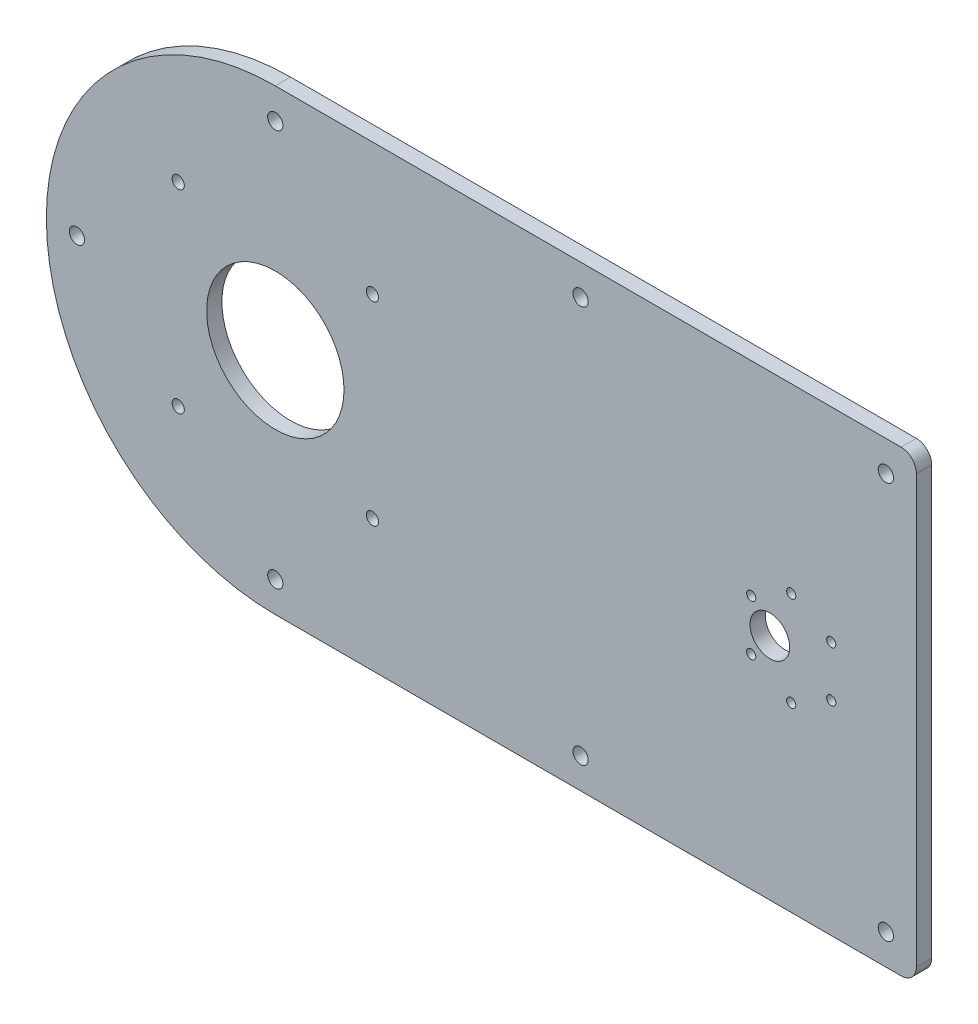
ISO-10303-21;
HEADER;
FILE_DESCRIPTION(('STEP AP214'),'2;1');
FILE_NAME('part.step','',(''),(''),'','','');
FILE_SCHEMA(('AUTOMOTIVE_DESIGN { 1 0 10303 214 1 1 1 1 }'));
ENDSEC;
DATA;
#1=APPLICATION_CONTEXT('core data for automotive mechanical design processes');
#2=APPLICATION_PROTOCOL_DEFINITION('international standard','automotive_design',2000,#1);
#3=PRODUCT_CONTEXT('',#1,'mechanical');
#4=PRODUCT('Part','Part','',(#3));
#5=PRODUCT_RELATED_PRODUCT_CATEGORY('part','',(#4));
#6=PRODUCT_DEFINITION_FORMATION('','',#4);
#7=PRODUCT_DEFINITION_CONTEXT('part definition',#1,'design');
#8=PRODUCT_DEFINITION('design','',#6,#7);
#9=PRODUCT_DEFINITION_SHAPE('','',#8);
#10=(LENGTH_UNIT() NAMED_UNIT(*) SI_UNIT(.MILLI.,.METRE.));
#11=(NAMED_UNIT(*) PLANE_ANGLE_UNIT() SI_UNIT($,.RADIAN.));
#12=(NAMED_UNIT(*) SI_UNIT($,.STERADIAN.) SOLID_ANGLE_UNIT());
#13=UNCERTAINTY_MEASURE_WITH_UNIT(LENGTH_MEASURE(1.E-05),#10,'distance_accuracy_value','');
#14=(GEOMETRIC_REPRESENTATION_CONTEXT(3) GLOBAL_UNCERTAINTY_ASSIGNED_CONTEXT((#13)) GLOBAL_UNIT_ASSIGNED_CONTEXT((#10,
#11,#12)) REPRESENTATION_CONTEXT('',''));
#15=CARTESIAN_POINT('',(0.,0.,0.));
#16=DIRECTION('',(0.,0.,1.));
#17=DIRECTION('',(1.,0.,0.));
#18=AXIS2_PLACEMENT_3D('',#15,#16,#17);
#19=CARTESIAN_POINT('',(30.0006920415225,17.5455264458724,5.));
#20=DIRECTION('',(0.,0.,1.));
#21=DIRECTION('',(1.,0.,0.));
#22=AXIS2_PLACEMENT_3D('',#19,#20,#21);
#23=PLANE('',#22);
#24=CARTESIAN_POINT('',(212.107976736033,9.27213004916545,5.));
#25=DIRECTION('',(0.,0.,1.));
#26=DIRECTION('',(1.,0.,0.));
#27=AXIS2_PLACEMENT_3D('',#24,#25,#26);
#28=CIRCLE('',#27,1.5);
#29=CARTESIAN_POINT('',(213.607976736033,9.27213004916545,5.));
#30=VERTEX_POINT('',#29);
#31=EDGE_CURVE('E248',#30,#30,#28,.T.);
#32=ORIENTED_EDGE('',*,*,#31,.F.);
#33=EDGE_LOOP('',(#32));
#34=FACE_BOUND('',#33,.T.);
#35=CARTESIAN_POINT('',(-1.81430795847747,49.3605264458724,5.));
#36=DIRECTION('',(0.,0.,1.));
#37=DIRECTION('',(1.,0.,0.));
#38=AXIS2_PLACEMENT_3D('',#35,#36,#37);
#39=CIRCLE('',#38,2.);
#40=CARTESIAN_POINT('',(0.185692041522529,49.3605264458724,5.));
#41=VERTEX_POINT('',#40);
#42=EDGE_CURVE('E260',#41,#41,#39,.T.);
#43=ORIENTED_EDGE('',*,*,#42,.F.);
#44=EDGE_LOOP('',(#43));
#45=FACE_BOUND('',#44,.T.);
#46=CARTESIAN_POINT('',(61.8156920415225,49.3605264458724,5.));
#47=DIRECTION('',(0.,0.,1.));
#48=DIRECTION('',(1.,0.,0.));
#49=AXIS2_PLACEMENT_3D('',#46,#47,#48);
#50=CIRCLE('',#49,1.99999999999999);
#51=CARTESIAN_POINT('',(63.8156920415225,49.3605264458724,5.));
#52=VERTEX_POINT('',#51);
#53=EDGE_CURVE('E272',#52,#52,#50,.T.);
#54=ORIENTED_EDGE('',*,*,#53,.F.);
#55=EDGE_LOOP('',(#54));
#56=FACE_BOUND('',#55,.T.);
#57=CARTESIAN_POINT('',(199.000692041523,2.04552644587243,5.));
#58=DIRECTION('',(0.,0.,1.));
#59=DIRECTION('',(1.,0.,0.));
#60=AXIS2_PLACEMENT_3D('',#57,#58,#59);
#61=CIRCLE('',#60,1.5);
#62=CARTESIAN_POINT('',(200.500692041523,2.04552644587243,5.));
#63=VERTEX_POINT('',#62);
#64=EDGE_CURVE('E284',#63,#63,#61,.T.);
#65=ORIENTED_EDGE('',*,*,#64,.F.);
#66=EDGE_LOOP('',(#65));
#67=FACE_BOUND('',#66,.T.);
#68=CARTESIAN_POINT('',(130.000692041523,-47.4544735541276,5.));
#69=DIRECTION('',(0.,0.,1.));
#70=DIRECTION('',(1.,0.,0.));
#71=AXIS2_PLACEMENT_3D('',#68,#69,#70);
#72=CIRCLE('',#71,2.5);
#73=CARTESIAN_POINT('',(132.500692041523,-47.4544735541276,5.));
#74=VERTEX_POINT('',#73);
#75=EDGE_CURVE('E296',#74,#74,#72,.T.);
#76=ORIENTED_EDGE('',*,*,#75,.F.);
#77=EDGE_LOOP('',(#76));
#78=FACE_BOUND('',#77,.T.);
#79=CARTESIAN_POINT('',(230.000692041523,82.5455264458725,5.));
#80=DIRECTION('',(0.,0.,1.));
#81=DIRECTION('',(1.,0.,0.));
#82=AXIS2_PLACEMENT_3D('',#79,#80,#81);
#83=CIRCLE('',#82,2.5);
#84=CARTESIAN_POINT('',(232.500692041523,82.5455264458725,5.));
#85=VERTEX_POINT('',#84);
#86=EDGE_CURVE('E308',#85,#85,#83,.T.);
#87=ORIENTED_EDGE('',*,*,#86,.F.);
#88=EDGE_LOOP('',(#87));
#89=FACE_BOUND('',#88,.T.);
#90=CARTESIAN_POINT('',(30.0006920415225,82.5455264458725,5.));
#91=DIRECTION('',(0.,0.,1.));
#92=DIRECTION('',(1.,0.,0.));
#93=AXIS2_PLACEMENT_3D('',#90,#91,#92);
#94=CIRCLE('',#93,2.5);
#95=CARTESIAN_POINT('',(32.5006920415225,82.5455264458725,5.));
#96=VERTEX_POINT('',#95);
#97=EDGE_CURVE('E320',#96,#96,#94,.T.);
#98=ORIENTED_EDGE('',*,*,#97,.F.);
#99=EDGE_LOOP('',(#98));
#100=FACE_BOUND('',#99,.T.);
#101=CARTESIAN_POINT('',(192.000692041523,17.5455264458725,5.));
#102=DIRECTION('',(0.,0.,1.));
#103=DIRECTION('',(1.,0.,0.));
#104=AXIS2_PLACEMENT_3D('',#101,#102,#103);
#105=CIRCLE('',#104,6.50000000000002);
#106=CARTESIAN_POINT('',(198.500692041523,17.5455264458725,5.));
#107=VERTEX_POINT('',#106);
#108=EDGE_CURVE('E332',#107,#107,#105,.T.);
#109=ORIENTED_EDGE('',*,*,#108,.F.);
#110=EDGE_LOOP('',(#109));
#111=FACE_BOUND('',#110,.T.);
#112=CARTESIAN_POINT('',(185.893407347012,25.8189228425795,5.));
#113=DIRECTION('',(0.,0.,1.));
#114=DIRECTION('',(1.,0.,0.));
#115=AXIS2_PLACEMENT_3D('',#112,#113,#114);
#116=CIRCLE('',#115,1.5);
#117=CARTESIAN_POINT('',(187.393407347012,25.8189228425795,5.));
#118=VERTEX_POINT('',#117);
#119=EDGE_CURVE('E344',#118,#118,#116,.T.);
#120=ORIENTED_EDGE('',*,*,#119,.F.);
#121=EDGE_LOOP('',(#120));
#122=FACE_BOUND('',#121,.T.);
#123=CARTESIAN_POINT('',(30.0006920415225,17.5455264458724,5.));
#124=DIRECTION('',(0.,0.,1.));
#125=DIRECTION('',(1.,0.,0.));
#126=AXIS2_PLACEMENT_3D('',#123,#124,#125);
#127=CIRCLE('',#126,75.);
#128=CARTESIAN_POINT('',(30.0006920415225,92.5455264458725,5.));
#129=VERTEX_POINT('',#128);
#130=CARTESIAN_POINT('',(30.0006920415225,-57.4544735541275,5.));
#131=VERTEX_POINT('',#130);
#132=EDGE_CURVE('E128',#129,#131,#127,.T.);
#133=ORIENTED_EDGE('',*,*,#132,.T.);
#134=DIRECTION('',(1.,0.,0.));
#135=VECTOR('',#134,1.);
#136=CARTESIAN_POINT('',(30.0006920415225,-57.4544735541275,5.));
#137=LINE('',#136,#135);
#138=CARTESIAN_POINT('',(235.000692041522,-57.4544735541275,5.));
#139=VERTEX_POINT('',#138);
#140=EDGE_CURVE('E86',#131,#139,#137,.T.);
#141=ORIENTED_EDGE('',*,*,#140,.T.);
#142=CARTESIAN_POINT('',(235.000692041523,-52.4544735541275,5.));
#143=DIRECTION('',(0.,0.,1.));
#144=DIRECTION('',(1.,0.,0.));
#145=AXIS2_PLACEMENT_3D('',#142,#143,#144);
#146=CIRCLE('',#145,4.99999999999999);
#147=CARTESIAN_POINT('',(240.000692041522,-52.4544735541275,5.));
#148=VERTEX_POINT('',#147);
#149=EDGE_CURVE('E99',#139,#148,#146,.T.);
#150=ORIENTED_EDGE('',*,*,#149,.T.);
#151=DIRECTION('',(0.,1.,0.));
#152=VECTOR('',#151,1.);
#153=CARTESIAN_POINT('',(240.000692041522,87.5455264458725,5.));
#154=LINE('',#153,#152);
#155=CARTESIAN_POINT('',(240.000692041522,87.5455264458725,5.));
#156=VERTEX_POINT('',#155);
#157=EDGE_CURVE('E93',#148,#156,#154,.T.);
#158=ORIENTED_EDGE('',*,*,#157,.T.);
#159=CARTESIAN_POINT('',(235.000692041523,87.5455264458725,5.));
#160=DIRECTION('',(0.,0.,1.));
#161=DIRECTION('',(-1.,0.,0.));
#162=AXIS2_PLACEMENT_3D('',#159,#160,#161);
#163=CIRCLE('',#162,4.99999999999998);
#164=CARTESIAN_POINT('',(235.000692041522,92.5455264458724,5.));
#165=VERTEX_POINT('',#164);
#166=EDGE_CURVE('E97',#156,#165,#163,.T.);
#167=ORIENTED_EDGE('',*,*,#166,.T.);
#168=DIRECTION('',(-1.,0.,0.));
#169=VECTOR('',#168,1.);
#170=CARTESIAN_POINT('',(30.0006920415225,92.5455264458725,5.));
#171=LINE('',#170,#169);
#172=EDGE_CURVE('E49',#165,#129,#171,.T.);
#173=ORIENTED_EDGE('',*,*,#172,.T.);
#174=EDGE_LOOP('',(#133,#141,#150,#158,#167,#173));
#175=FACE_BOUND('',#174,.T.);
#176=CARTESIAN_POINT('',(-34.9993079584775,17.5455264458724,5.));
#177=DIRECTION('',(0.,0.,1.));
#178=DIRECTION('',(1.,0.,0.));
#179=AXIS2_PLACEMENT_3D('',#176,#177,#178);
#180=CIRCLE('',#179,2.5);
#181=CARTESIAN_POINT('',(-32.4993079584775,17.5455264458724,5.));
#182=VERTEX_POINT('',#181);
#183=EDGE_CURVE('E121',#182,#182,#180,.T.);
#184=ORIENTED_EDGE('',*,*,#183,.F.);
#185=EDGE_LOOP('',(#184));
#186=FACE_BOUND('',#185,.T.);
#187=CARTESIAN_POINT('',(30.0006920415225,17.5455264458724,5.));
#188=DIRECTION('',(0.,0.,1.));
#189=DIRECTION('',(1.,0.,0.));
#190=AXIS2_PLACEMENT_3D('',#187,#188,#189);
#191=CIRCLE('',#190,22.5);
#192=CARTESIAN_POINT('',(52.5006920415225,17.5455264458724,5.));
#193=VERTEX_POINT('',#192);
#194=EDGE_CURVE('E338',#193,#193,#191,.T.);
#195=ORIENTED_EDGE('',*,*,#194,.F.);
#196=EDGE_LOOP('',(#195));
#197=FACE_BOUND('',#196,.T.);
#198=CARTESIAN_POINT('',(30.0006920415225,-47.4544735541276,5.));
#199=DIRECTION('',(0.,0.,1.));
#200=DIRECTION('',(1.,0.,0.));
#201=AXIS2_PLACEMENT_3D('',#198,#199,#200);
#202=CIRCLE('',#201,2.5);
#203=CARTESIAN_POINT('',(32.5006920415225,-47.4544735541276,5.));
#204=VERTEX_POINT('',#203);
#205=EDGE_CURVE('E326',#204,#204,#202,.T.);
#206=ORIENTED_EDGE('',*,*,#205,.F.);
#207=EDGE_LOOP('',(#206));
#208=FACE_BOUND('',#207,.T.);
#209=CARTESIAN_POINT('',(230.000692041523,-47.4544735541276,5.));
#210=DIRECTION('',(0.,0.,1.));
#211=DIRECTION('',(1.,0.,0.));
#212=AXIS2_PLACEMENT_3D('',#209,#210,#211);
#213=CIRCLE('',#212,2.5);
#214=CARTESIAN_POINT('',(232.500692041523,-47.4544735541276,5.));
#215=VERTEX_POINT('',#214);
#216=EDGE_CURVE('E314',#215,#215,#213,.T.);
#217=ORIENTED_EDGE('',*,*,#216,.F.);
#218=EDGE_LOOP('',(#217));
#219=FACE_BOUND('',#218,.T.);
#220=CARTESIAN_POINT('',(130.000692041523,82.5455264458725,5.));
#221=DIRECTION('',(0.,0.,1.));
#222=DIRECTION('',(1.,0.,0.));
#223=AXIS2_PLACEMENT_3D('',#220,#221,#222);
#224=CIRCLE('',#223,2.5);
#225=CARTESIAN_POINT('',(132.500692041523,82.5455264458725,5.));
#226=VERTEX_POINT('',#225);
#227=EDGE_CURVE('E302',#226,#226,#224,.T.);
#228=ORIENTED_EDGE('',*,*,#227,.F.);
#229=EDGE_LOOP('',(#228));
#230=FACE_BOUND('',#229,.T.);
#231=CARTESIAN_POINT('',(199.000692041523,33.0455264458725,5.));
#232=DIRECTION('',(0.,0.,1.));
#233=DIRECTION('',(1.,0.,0.));
#234=AXIS2_PLACEMENT_3D('',#231,#232,#233);
#235=CIRCLE('',#234,1.5);
#236=CARTESIAN_POINT('',(200.500692041523,33.0455264458725,5.));
#237=VERTEX_POINT('',#236);
#238=EDGE_CURVE('E290',#237,#237,#235,.T.);
#239=ORIENTED_EDGE('',*,*,#238,.F.);
#240=EDGE_LOOP('',(#239));
#241=FACE_BOUND('',#240,.T.);
#242=CARTESIAN_POINT('',(61.8156920415225,-14.2694735541276,5.));
#243=DIRECTION('',(0.,0.,1.));
#244=DIRECTION('',(1.,0.,0.));
#245=AXIS2_PLACEMENT_3D('',#242,#243,#244);
#246=CIRCLE('',#245,1.99999999999999);
#247=CARTESIAN_POINT('',(63.8156920415225,-14.2694735541276,5.));
#248=VERTEX_POINT('',#247);
#249=EDGE_CURVE('E278',#248,#248,#246,.T.);
#250=ORIENTED_EDGE('',*,*,#249,.F.);
#251=EDGE_LOOP('',(#250));
#252=FACE_BOUND('',#251,.T.);
#253=CARTESIAN_POINT('',(-1.81430795847747,-14.2694735541276,5.));
#254=DIRECTION('',(0.,0.,1.));
#255=DIRECTION('',(1.,0.,0.));
#256=AXIS2_PLACEMENT_3D('',#253,#254,#255);
#257=CIRCLE('',#256,2.);
#258=CARTESIAN_POINT('',(0.185692041522535,-14.2694735541276,5.));
#259=VERTEX_POINT('',#258);
#260=EDGE_CURVE('E266',#259,#259,#257,.T.);
#261=ORIENTED_EDGE('',*,*,#260,.F.);
#262=EDGE_LOOP('',(#261));
#263=FACE_BOUND('',#262,.T.);
#264=CARTESIAN_POINT('',(212.107976736033,25.8189228425795,5.));
#265=DIRECTION('',(0.,0.,1.));
#266=DIRECTION('',(1.,0.,0.));
#267=AXIS2_PLACEMENT_3D('',#264,#265,#266);
#268=CIRCLE('',#267,1.5);
#269=CARTESIAN_POINT('',(213.607976736033,25.8189228425795,5.));
#270=VERTEX_POINT('',#269);
#271=EDGE_CURVE('E254',#270,#270,#268,.T.);
#272=ORIENTED_EDGE('',*,*,#271,.F.);
#273=EDGE_LOOP('',(#272));
#274=FACE_BOUND('',#273,.T.);
#275=CARTESIAN_POINT('',(185.893407347012,9.27213004916545,5.));
#276=DIRECTION('',(0.,0.,1.));
#277=DIRECTION('',(1.,0.,0.));
#278=AXIS2_PLACEMENT_3D('',#275,#276,#277);
#279=CIRCLE('',#278,1.5);
#280=CARTESIAN_POINT('',(187.393407347012,9.27213004916545,5.));
#281=VERTEX_POINT('',#280);
#282=EDGE_CURVE('E239',#281,#281,#279,.T.);
#283=ORIENTED_EDGE('',*,*,#282,.F.);
#284=EDGE_LOOP('',(#283));
#285=FACE_BOUND('',#284,.T.);
#286=ADVANCED_FACE('F32',(#34,#45,#56,#67,#78,#89,#100,#111,#122,#175,#186,#197,#208,#219,#230,
#241,#252,#263,#274,#285),#23,.T.);
#287=CARTESIAN_POINT('',(30.0006920415225,17.5455264458724,0.));
#288=DIRECTION('',(0.,0.,1.));
#289=DIRECTION('',(1.,0.,0.));
#290=AXIS2_PLACEMENT_3D('',#287,#288,#289);
#291=PLANE('',#290);
#292=CARTESIAN_POINT('',(30.0006920415225,17.5455264458724,0.));
#293=DIRECTION('',(0.,0.,1.));
#294=DIRECTION('',(1.,0.,0.));
#295=AXIS2_PLACEMENT_3D('',#292,#293,#294);
#296=CIRCLE('',#295,75.);
#297=CARTESIAN_POINT('',(30.0006920415225,92.5455264458725,0.));
#298=VERTEX_POINT('',#297);
#299=CARTESIAN_POINT('',(30.0006920415225,-57.4544735541275,0.));
#300=VERTEX_POINT('',#299);
#301=EDGE_CURVE('E117',#298,#300,#296,.T.);
#302=ORIENTED_EDGE('',*,*,#301,.F.);
#303=DIRECTION('',(-1.,0.,0.));
#304=VECTOR('',#303,1.);
#305=CARTESIAN_POINT('',(30.0006920415225,92.5455264458725,0.));
#306=LINE('',#305,#304);
#307=CARTESIAN_POINT('',(235.000692041522,92.5455264458724,0.));
#308=VERTEX_POINT('',#307);
#309=EDGE_CURVE('E78',#308,#298,#306,.T.);
#310=ORIENTED_EDGE('',*,*,#309,.F.);
#311=CARTESIAN_POINT('',(235.000692041523,87.5455264458725,0.));
#312=DIRECTION('',(0.,0.,1.));
#313=DIRECTION('',(-1.,0.,0.));
#314=AXIS2_PLACEMENT_3D('',#311,#312,#313);
#315=CIRCLE('',#314,4.99999999999998);
#316=CARTESIAN_POINT('',(240.000692041522,87.5455264458725,0.));
#317=VERTEX_POINT('',#316);
#318=EDGE_CURVE('E72',#317,#308,#315,.T.);
#319=ORIENTED_EDGE('',*,*,#318,.F.);
#320=DIRECTION('',(0.,1.,0.));
#321=VECTOR('',#320,1.);
#322=CARTESIAN_POINT('',(240.000692041522,87.5455264458725,0.));
#323=LINE('',#322,#321);
#324=CARTESIAN_POINT('',(240.000692041522,-52.4544735541275,0.));
#325=VERTEX_POINT('',#324);
#326=EDGE_CURVE('E107',#325,#317,#323,.T.);
#327=ORIENTED_EDGE('',*,*,#326,.F.);
#328=CARTESIAN_POINT('',(235.000692041523,-52.4544735541275,0.));
#329=DIRECTION('',(0.,0.,1.));
#330=DIRECTION('',(1.,0.,0.));
#331=AXIS2_PLACEMENT_3D('',#328,#329,#330);
#332=CIRCLE('',#331,4.99999999999999);
#333=CARTESIAN_POINT('',(235.000692041522,-57.4544735541275,0.));
#334=VERTEX_POINT('',#333);
#335=EDGE_CURVE('E123',#334,#325,#332,.T.);
#336=ORIENTED_EDGE('',*,*,#335,.F.);
#337=DIRECTION('',(1.,0.,0.));
#338=VECTOR('',#337,1.);
#339=CARTESIAN_POINT('',(30.0006920415225,-57.4544735541275,0.));
#340=LINE('',#339,#338);
#341=EDGE_CURVE('E120',#300,#334,#340,.T.);
#342=ORIENTED_EDGE('',*,*,#341,.F.);
#343=EDGE_LOOP('',(#302,#310,#319,#327,#336,#342));
#344=FACE_BOUND('',#343,.T.);
#345=CARTESIAN_POINT('',(-34.9993079584775,17.5455264458724,0.));
#346=DIRECTION('',(0.,0.,1.));
#347=DIRECTION('',(1.,0.,0.));
#348=AXIS2_PLACEMENT_3D('',#345,#346,#347);
#349=CIRCLE('',#348,2.5);
#350=CARTESIAN_POINT('',(-32.4993079584775,17.5455264458724,0.));
#351=VERTEX_POINT('',#350);
#352=EDGE_CURVE('E347',#351,#351,#349,.T.);
#353=ORIENTED_EDGE('',*,*,#352,.T.);
#354=EDGE_LOOP('',(#353));
#355=FACE_BOUND('',#354,.T.);
#356=CARTESIAN_POINT('',(185.893407347012,25.8189228425795,0.));
#357=DIRECTION('',(0.,0.,1.));
#358=DIRECTION('',(1.,0.,0.));
#359=AXIS2_PLACEMENT_3D('',#356,#357,#358);
#360=CIRCLE('',#359,1.5);
#361=CARTESIAN_POINT('',(187.393407347012,25.8189228425795,0.));
#362=VERTEX_POINT('',#361);
#363=EDGE_CURVE('E341',#362,#362,#360,.T.);
#364=ORIENTED_EDGE('',*,*,#363,.T.);
#365=EDGE_LOOP('',(#364));
#366=FACE_BOUND('',#365,.T.);
#367=CARTESIAN_POINT('',(30.0006920415225,17.5455264458724,0.));
#368=DIRECTION('',(0.,0.,1.));
#369=DIRECTION('',(1.,0.,0.));
#370=AXIS2_PLACEMENT_3D('',#367,#368,#369);
#371=CIRCLE('',#370,22.5);
#372=CARTESIAN_POINT('',(52.5006920415225,17.5455264458724,0.));
#373=VERTEX_POINT('',#372);
#374=EDGE_CURVE('E335',#373,#373,#371,.T.);
#375=ORIENTED_EDGE('',*,*,#374,.T.);
#376=EDGE_LOOP('',(#375));
#377=FACE_BOUND('',#376,.T.);
#378=CARTESIAN_POINT('',(192.000692041523,17.5455264458725,0.));
#379=DIRECTION('',(0.,0.,1.));
#380=DIRECTION('',(1.,0.,0.));
#381=AXIS2_PLACEMENT_3D('',#378,#379,#380);
#382=CIRCLE('',#381,6.50000000000002);
#383=CARTESIAN_POINT('',(198.500692041523,17.5455264458725,0.));
#384=VERTEX_POINT('',#383);
#385=EDGE_CURVE('E329',#384,#384,#382,.T.);
#386=ORIENTED_EDGE('',*,*,#385,.T.);
#387=EDGE_LOOP('',(#386));
#388=FACE_BOUND('',#387,.T.);
#389=CARTESIAN_POINT('',(30.0006920415225,-47.4544735541276,0.));
#390=DIRECTION('',(0.,0.,1.));
#391=DIRECTION('',(1.,0.,0.));
#392=AXIS2_PLACEMENT_3D('',#389,#390,#391);
#393=CIRCLE('',#392,2.5);
#394=CARTESIAN_POINT('',(32.5006920415225,-47.4544735541276,0.));
#395=VERTEX_POINT('',#394);
#396=EDGE_CURVE('E323',#395,#395,#393,.T.);
#397=ORIENTED_EDGE('',*,*,#396,.T.);
#398=EDGE_LOOP('',(#397));
#399=FACE_BOUND('',#398,.T.);
#400=CARTESIAN_POINT('',(30.0006920415225,82.5455264458725,0.));
#401=DIRECTION('',(0.,0.,1.));
#402=DIRECTION('',(1.,0.,0.));
#403=AXIS2_PLACEMENT_3D('',#400,#401,#402);
#404=CIRCLE('',#403,2.5);
#405=CARTESIAN_POINT('',(32.5006920415225,82.5455264458725,0.));
#406=VERTEX_POINT('',#405);
#407=EDGE_CURVE('E317',#406,#406,#404,.T.);
#408=ORIENTED_EDGE('',*,*,#407,.T.);
#409=EDGE_LOOP('',(#408));
#410=FACE_BOUND('',#409,.T.);
#411=CARTESIAN_POINT('',(230.000692041523,-47.4544735541276,0.));
#412=DIRECTION('',(0.,0.,1.));
#413=DIRECTION('',(1.,0.,0.));
#414=AXIS2_PLACEMENT_3D('',#411,#412,#413);
#415=CIRCLE('',#414,2.5);
#416=CARTESIAN_POINT('',(232.500692041523,-47.4544735541276,0.));
#417=VERTEX_POINT('',#416);
#418=EDGE_CURVE('E311',#417,#417,#415,.T.);
#419=ORIENTED_EDGE('',*,*,#418,.T.);
#420=EDGE_LOOP('',(#419));
#421=FACE_BOUND('',#420,.T.);
#422=CARTESIAN_POINT('',(230.000692041523,82.5455264458725,0.));
#423=DIRECTION('',(0.,0.,1.));
#424=DIRECTION('',(1.,0.,0.));
#425=AXIS2_PLACEMENT_3D('',#422,#423,#424);
#426=CIRCLE('',#425,2.5);
#427=CARTESIAN_POINT('',(232.500692041523,82.5455264458725,0.));
#428=VERTEX_POINT('',#427);
#429=EDGE_CURVE('E305',#428,#428,#426,.T.);
#430=ORIENTED_EDGE('',*,*,#429,.T.);
#431=EDGE_LOOP('',(#430));
#432=FACE_BOUND('',#431,.T.);
#433=CARTESIAN_POINT('',(130.000692041523,82.5455264458725,0.));
#434=DIRECTION('',(0.,0.,1.));
#435=DIRECTION('',(1.,0.,0.));
#436=AXIS2_PLACEMENT_3D('',#433,#434,#435);
#437=CIRCLE('',#436,2.5);
#438=CARTESIAN_POINT('',(132.500692041523,82.5455264458725,0.));
#439=VERTEX_POINT('',#438);
#440=EDGE_CURVE('E299',#439,#439,#437,.T.);
#441=ORIENTED_EDGE('',*,*,#440,.T.);
#442=EDGE_LOOP('',(#441));
#443=FACE_BOUND('',#442,.T.);
#444=CARTESIAN_POINT('',(130.000692041523,-47.4544735541276,0.));
#445=DIRECTION('',(0.,0.,1.));
#446=DIRECTION('',(1.,0.,0.));
#447=AXIS2_PLACEMENT_3D('',#444,#445,#446);
#448=CIRCLE('',#447,2.5);
#449=CARTESIAN_POINT('',(132.500692041523,-47.4544735541276,0.));
#450=VERTEX_POINT('',#449);
#451=EDGE_CURVE('E293',#450,#450,#448,.T.);
#452=ORIENTED_EDGE('',*,*,#451,.T.);
#453=EDGE_LOOP('',(#452));
#454=FACE_BOUND('',#453,.T.);
#455=CARTESIAN_POINT('',(199.000692041523,33.0455264458725,0.));
#456=DIRECTION('',(0.,0.,1.));
#457=DIRECTION('',(1.,0.,0.));
#458=AXIS2_PLACEMENT_3D('',#455,#456,#457);
#459=CIRCLE('',#458,1.5);
#460=CARTESIAN_POINT('',(200.500692041523,33.0455264458725,0.));
#461=VERTEX_POINT('',#460);
#462=EDGE_CURVE('E287',#461,#461,#459,.T.);
#463=ORIENTED_EDGE('',*,*,#462,.T.);
#464=EDGE_LOOP('',(#463));
#465=FACE_BOUND('',#464,.T.);
#466=CARTESIAN_POINT('',(199.000692041523,2.04552644587243,0.));
#467=DIRECTION('',(0.,0.,1.));
#468=DIRECTION('',(1.,0.,0.));
#469=AXIS2_PLACEMENT_3D('',#466,#467,#468);
#470=CIRCLE('',#469,1.5);
#471=CARTESIAN_POINT('',(200.500692041523,2.04552644587243,0.));
#472=VERTEX_POINT('',#471);
#473=EDGE_CURVE('E281',#472,#472,#470,.T.);
#474=ORIENTED_EDGE('',*,*,#473,.T.);
#475=EDGE_LOOP('',(#474));
#476=FACE_BOUND('',#475,.T.);
#477=CARTESIAN_POINT('',(61.8156920415225,-14.2694735541276,0.));
#478=DIRECTION('',(0.,0.,1.));
#479=DIRECTION('',(1.,0.,0.));
#480=AXIS2_PLACEMENT_3D('',#477,#478,#479);
#481=CIRCLE('',#480,1.99999999999999);
#482=CARTESIAN_POINT('',(63.8156920415225,-14.2694735541276,0.));
#483=VERTEX_POINT('',#482);
#484=EDGE_CURVE('E275',#483,#483,#481,.T.);
#485=ORIENTED_EDGE('',*,*,#484,.T.);
#486=EDGE_LOOP('',(#485));
#487=FACE_BOUND('',#486,.T.);
#488=CARTESIAN_POINT('',(61.8156920415225,49.3605264458724,0.));
#489=DIRECTION('',(0.,0.,1.));
#490=DIRECTION('',(1.,0.,0.));
#491=AXIS2_PLACEMENT_3D('',#488,#489,#490);
#492=CIRCLE('',#491,1.99999999999999);
#493=CARTESIAN_POINT('',(63.8156920415225,49.3605264458724,0.));
#494=VERTEX_POINT('',#493);
#495=EDGE_CURVE('E269',#494,#494,#492,.T.);
#496=ORIENTED_EDGE('',*,*,#495,.T.);
#497=EDGE_LOOP('',(#496));
#498=FACE_BOUND('',#497,.T.);
#499=CARTESIAN_POINT('',(-1.81430795847747,-14.2694735541276,0.));
#500=DIRECTION('',(0.,0.,1.));
#501=DIRECTION('',(1.,0.,0.));
#502=AXIS2_PLACEMENT_3D('',#499,#500,#501);
#503=CIRCLE('',#502,2.);
#504=CARTESIAN_POINT('',(0.185692041522535,-14.2694735541276,0.));
#505=VERTEX_POINT('',#504);
#506=EDGE_CURVE('E263',#505,#505,#503,.T.);
#507=ORIENTED_EDGE('',*,*,#506,.T.);
#508=EDGE_LOOP('',(#507));
#509=FACE_BOUND('',#508,.T.);
#510=CARTESIAN_POINT('',(-1.81430795847747,49.3605264458724,0.));
#511=DIRECTION('',(0.,0.,1.));
#512=DIRECTION('',(1.,0.,0.));
#513=AXIS2_PLACEMENT_3D('',#510,#511,#512);
#514=CIRCLE('',#513,2.);
#515=CARTESIAN_POINT('',(0.185692041522529,49.3605264458724,0.));
#516=VERTEX_POINT('',#515);
#517=EDGE_CURVE('E257',#516,#516,#514,.T.);
#518=ORIENTED_EDGE('',*,*,#517,.T.);
#519=EDGE_LOOP('',(#518));
#520=FACE_BOUND('',#519,.T.);
#521=CARTESIAN_POINT('',(212.107976736033,25.8189228425795,0.));
#522=DIRECTION('',(0.,0.,1.));
#523=DIRECTION('',(1.,0.,0.));
#524=AXIS2_PLACEMENT_3D('',#521,#522,#523);
#525=CIRCLE('',#524,1.5);
#526=CARTESIAN_POINT('',(213.607976736033,25.8189228425795,0.));
#527=VERTEX_POINT('',#526);
#528=EDGE_CURVE('E251',#527,#527,#525,.T.);
#529=ORIENTED_EDGE('',*,*,#528,.T.);
#530=EDGE_LOOP('',(#529));
#531=FACE_BOUND('',#530,.T.);
#532=CARTESIAN_POINT('',(212.107976736033,9.27213004916545,0.));
#533=DIRECTION('',(0.,0.,1.));
#534=DIRECTION('',(1.,0.,0.));
#535=AXIS2_PLACEMENT_3D('',#532,#533,#534);
#536=CIRCLE('',#535,1.5);
#537=CARTESIAN_POINT('',(213.607976736033,9.27213004916545,0.));
#538=VERTEX_POINT('',#537);
#539=EDGE_CURVE('E245',#538,#538,#536,.T.);
#540=ORIENTED_EDGE('',*,*,#539,.T.);
#541=EDGE_LOOP('',(#540));
#542=FACE_BOUND('',#541,.T.);
#543=CARTESIAN_POINT('',(185.893407347012,9.27213004916545,0.));
#544=DIRECTION('',(0.,0.,1.));
#545=DIRECTION('',(1.,0.,0.));
#546=AXIS2_PLACEMENT_3D('',#543,#544,#545);
#547=CIRCLE('',#546,1.5);
#548=CARTESIAN_POINT('',(187.393407347012,9.27213004916545,0.));
#549=VERTEX_POINT('',#548);
#550=EDGE_CURVE('E242',#549,#549,#547,.T.);
#551=ORIENTED_EDGE('',*,*,#550,.T.);
#552=EDGE_LOOP('',(#551));
#553=FACE_BOUND('',#552,.T.);
#554=ADVANCED_FACE('F137',(#344,#355,#366,#377,#388,#399,#410,#421,#432,#443,#454,#465,#476,
#487,#498,#509,#520,#531,#542,#553),#291,.F.);
#555=CARTESIAN_POINT('',(30.0006920415225,17.5455264458724,5.));
#556=DIRECTION('',(0.,0.,-1.));
#557=DIRECTION('',(-1.,0.,0.));
#558=AXIS2_PLACEMENT_3D('',#555,#556,#557);
#559=CYLINDRICAL_SURFACE('',#558,75.);
#560=ORIENTED_EDGE('',*,*,#301,.T.);
#561=DIRECTION('',(0.,0.,-1.));
#562=VECTOR('',#561,1.);
#563=CARTESIAN_POINT('',(30.0006920415225,-57.4544735541275,5.));
#564=LINE('',#563,#562);
#565=EDGE_CURVE('E11',#131,#300,#564,.T.);
#566=ORIENTED_EDGE('',*,*,#565,.F.);
#567=ORIENTED_EDGE('',*,*,#132,.F.);
#568=DIRECTION('',(0.,0.,-1.));
#569=VECTOR('',#568,1.);
#570=CARTESIAN_POINT('',(30.0006920415225,92.5455264458725,5.));
#571=LINE('',#570,#569);
#572=EDGE_CURVE('E113',#129,#298,#571,.T.);
#573=ORIENTED_EDGE('',*,*,#572,.T.);
#574=EDGE_LOOP('',(#560,#566,#567,#573));
#575=FACE_BOUND('',#574,.T.);
#576=ADVANCED_FACE('F34',(#575),#559,.T.);
#577=CARTESIAN_POINT('',(30.0006920415225,-57.4544735541275,5.));
#578=DIRECTION('',(0.,1.,0.));
#579=DIRECTION('',(0.,0.,1.));
#580=AXIS2_PLACEMENT_3D('',#577,#578,#579);
#581=PLANE('',#580);
#582=ORIENTED_EDGE('',*,*,#341,.T.);
#583=DIRECTION('',(0.,0.,-1.));
#584=VECTOR('',#583,1.);
#585=CARTESIAN_POINT('',(235.000692041522,-57.4544735541275,5.));
#586=LINE('',#585,#584);
#587=EDGE_CURVE('E41',#139,#334,#586,.T.);
#588=ORIENTED_EDGE('',*,*,#587,.F.);
#589=ORIENTED_EDGE('',*,*,#140,.F.);
#590=ORIENTED_EDGE('',*,*,#565,.T.);
#591=EDGE_LOOP('',(#582,#588,#589,#590));
#592=FACE_BOUND('',#591,.T.);
#593=ADVANCED_FACE('F540',(#592),#581,.F.);
#594=CARTESIAN_POINT('',(235.000692041523,-52.4544735541275,5.));
#595=DIRECTION('',(0.,0.,-1.));
#596=DIRECTION('',(-1.,0.,0.));
#597=AXIS2_PLACEMENT_3D('',#594,#595,#596);
#598=CYLINDRICAL_SURFACE('',#597,4.99999999999999);
#599=ORIENTED_EDGE('',*,*,#335,.T.);
#600=DIRECTION('',(0.,0.,-1.));
#601=VECTOR('',#600,1.);
#602=CARTESIAN_POINT('',(240.000692041522,-52.4544735541275,5.));
#603=LINE('',#602,#601);
#604=EDGE_CURVE('E108',#148,#325,#603,.T.);
#605=ORIENTED_EDGE('',*,*,#604,.F.);
#606=ORIENTED_EDGE('',*,*,#149,.F.);
#607=ORIENTED_EDGE('',*,*,#587,.T.);
#608=EDGE_LOOP('',(#599,#605,#606,#607));
#609=FACE_BOUND('',#608,.T.);
#610=ADVANCED_FACE('F134',(#609),#598,.T.);
#611=CARTESIAN_POINT('',(240.000692041522,87.5455264458725,5.));
#612=DIRECTION('',(-1.,0.,0.));
#613=DIRECTION('',(0.,-1.,0.));
#614=AXIS2_PLACEMENT_3D('',#611,#612,#613);
#615=PLANE('',#614);
#616=ORIENTED_EDGE('',*,*,#326,.T.);
#617=DIRECTION('',(0.,0.,-1.));
#618=VECTOR('',#617,1.);
#619=CARTESIAN_POINT('',(240.000692041522,87.5455264458725,5.));
#620=LINE('',#619,#618);
#621=EDGE_CURVE('E104',#156,#317,#620,.T.);
#622=ORIENTED_EDGE('',*,*,#621,.F.);
#623=ORIENTED_EDGE('',*,*,#157,.F.);
#624=ORIENTED_EDGE('',*,*,#604,.T.);
#625=EDGE_LOOP('',(#616,#622,#623,#624));
#626=FACE_BOUND('',#625,.T.);
#627=ADVANCED_FACE('F105',(#626),#615,.F.);
#628=CARTESIAN_POINT('',(235.000692041523,87.5455264458725,5.));
#629=DIRECTION('',(0.,0.,-1.));
#630=DIRECTION('',(-1.,0.,0.));
#631=AXIS2_PLACEMENT_3D('',#628,#629,#630);
#632=CYLINDRICAL_SURFACE('',#631,4.99999999999998);
#633=ORIENTED_EDGE('',*,*,#318,.T.);
#634=DIRECTION('',(0.,0.,-1.));
#635=VECTOR('',#634,1.);
#636=CARTESIAN_POINT('',(235.000692041522,92.5455264458724,5.));
#637=LINE('',#636,#635);
#638=EDGE_CURVE('E109',#165,#308,#637,.T.);
#639=ORIENTED_EDGE('',*,*,#638,.F.);
#640=ORIENTED_EDGE('',*,*,#166,.F.);
#641=ORIENTED_EDGE('',*,*,#621,.T.);
#642=EDGE_LOOP('',(#633,#639,#640,#641));
#643=FACE_BOUND('',#642,.T.);
#644=ADVANCED_FACE('F111',(#643),#632,.T.);
#645=CARTESIAN_POINT('',(30.0006920415225,92.5455264458725,5.));
#646=DIRECTION('',(0.,-1.,0.));
#647=DIRECTION('',(0.,0.,-1.));
#648=AXIS2_PLACEMENT_3D('',#645,#646,#647);
#649=PLANE('',#648);
#650=ORIENTED_EDGE('',*,*,#309,.T.);
#651=ORIENTED_EDGE('',*,*,#572,.F.);
#652=ORIENTED_EDGE('',*,*,#172,.F.);
#653=ORIENTED_EDGE('',*,*,#638,.T.);
#654=EDGE_LOOP('',(#650,#651,#652,#653));
#655=FACE_BOUND('',#654,.T.);
#656=ADVANCED_FACE('F142',(#655),#649,.F.);
#657=CARTESIAN_POINT('',(-34.9993079584775,17.5455264458724,5.));
#658=DIRECTION('',(0.,0.,-1.));
#659=DIRECTION('',(-1.,0.,0.));
#660=AXIS2_PLACEMENT_3D('',#657,#658,#659);
#661=CYLINDRICAL_SURFACE('',#660,2.5);
#662=ORIENTED_EDGE('',*,*,#183,.T.);
#663=EDGE_LOOP('',(#662));
#664=FACE_BOUND('',#663,.T.);
#665=ORIENTED_EDGE('',*,*,#352,.F.);
#666=EDGE_LOOP('',(#665));
#667=FACE_BOUND('',#666,.T.);
#668=ADVANCED_FACE('F144',(#664,#667),#661,.F.);
#669=CARTESIAN_POINT('',(185.893407347012,25.8189228425795,5.));
#670=DIRECTION('',(0.,0.,-1.));
#671=DIRECTION('',(-1.,0.,0.));
#672=AXIS2_PLACEMENT_3D('',#669,#670,#671);
#673=CYLINDRICAL_SURFACE('',#672,1.5);
#674=ORIENTED_EDGE('',*,*,#119,.T.);
#675=EDGE_LOOP('',(#674));
#676=FACE_BOUND('',#675,.T.);
#677=ORIENTED_EDGE('',*,*,#363,.F.);
#678=EDGE_LOOP('',(#677));
#679=FACE_BOUND('',#678,.T.);
#680=ADVANCED_FACE('F150',(#676,#679),#673,.F.);
#681=CARTESIAN_POINT('',(30.0006920415225,17.5455264458724,5.));
#682=DIRECTION('',(0.,0.,-1.));
#683=DIRECTION('',(-1.,0.,0.));
#684=AXIS2_PLACEMENT_3D('',#681,#682,#683);
#685=CYLINDRICAL_SURFACE('',#684,22.5);
#686=ORIENTED_EDGE('',*,*,#194,.T.);
#687=EDGE_LOOP('',(#686));
#688=FACE_BOUND('',#687,.T.);
#689=ORIENTED_EDGE('',*,*,#374,.F.);
#690=EDGE_LOOP('',(#689));
#691=FACE_BOUND('',#690,.T.);
#692=ADVANCED_FACE('F166',(#688,#691),#685,.F.);
#693=CARTESIAN_POINT('',(192.000692041523,17.5455264458725,5.));
#694=DIRECTION('',(0.,0.,-1.));
#695=DIRECTION('',(-1.,0.,0.));
#696=AXIS2_PLACEMENT_3D('',#693,#694,#695);
#697=CYLINDRICAL_SURFACE('',#696,6.50000000000002);
#698=ORIENTED_EDGE('',*,*,#108,.T.);
#699=EDGE_LOOP('',(#698));
#700=FACE_BOUND('',#699,.T.);
#701=ORIENTED_EDGE('',*,*,#385,.F.);
#702=EDGE_LOOP('',(#701));
#703=FACE_BOUND('',#702,.T.);
#704=ADVANCED_FACE('F170',(#700,#703),#697,.F.);
#705=CARTESIAN_POINT('',(30.0006920415225,-47.4544735541276,5.));
#706=DIRECTION('',(0.,0.,-1.));
#707=DIRECTION('',(-1.,0.,0.));
#708=AXIS2_PLACEMENT_3D('',#705,#706,#707);
#709=CYLINDRICAL_SURFACE('',#708,2.5);
#710=ORIENTED_EDGE('',*,*,#205,.T.);
#711=EDGE_LOOP('',(#710));
#712=FACE_BOUND('',#711,.T.);
#713=ORIENTED_EDGE('',*,*,#396,.F.);
#714=EDGE_LOOP('',(#713));
#715=FACE_BOUND('',#714,.T.);
#716=ADVANCED_FACE('F174',(#712,#715),#709,.F.);
#717=CARTESIAN_POINT('',(30.0006920415225,82.5455264458725,5.));
#718=DIRECTION('',(0.,0.,-1.));
#719=DIRECTION('',(-1.,0.,0.));
#720=AXIS2_PLACEMENT_3D('',#717,#718,#719);
#721=CYLINDRICAL_SURFACE('',#720,2.5);
#722=ORIENTED_EDGE('',*,*,#97,.T.);
#723=EDGE_LOOP('',(#722));
#724=FACE_BOUND('',#723,.T.);
#725=ORIENTED_EDGE('',*,*,#407,.F.);
#726=EDGE_LOOP('',(#725));
#727=FACE_BOUND('',#726,.T.);
#728=ADVANCED_FACE('F178',(#724,#727),#721,.F.);
#729=CARTESIAN_POINT('',(230.000692041523,-47.4544735541276,5.));
#730=DIRECTION('',(0.,0.,-1.));
#731=DIRECTION('',(-1.,0.,0.));
#732=AXIS2_PLACEMENT_3D('',#729,#730,#731);
#733=CYLINDRICAL_SURFACE('',#732,2.5);
#734=ORIENTED_EDGE('',*,*,#216,.T.);
#735=EDGE_LOOP('',(#734));
#736=FACE_BOUND('',#735,.T.);
#737=ORIENTED_EDGE('',*,*,#418,.F.);
#738=EDGE_LOOP('',(#737));
#739=FACE_BOUND('',#738,.T.);
#740=ADVANCED_FACE('F182',(#736,#739),#733,.F.);
#741=CARTESIAN_POINT('',(230.000692041523,82.5455264458725,5.));
#742=DIRECTION('',(0.,0.,-1.));
#743=DIRECTION('',(-1.,0.,0.));
#744=AXIS2_PLACEMENT_3D('',#741,#742,#743);
#745=CYLINDRICAL_SURFACE('',#744,2.5);
#746=ORIENTED_EDGE('',*,*,#86,.T.);
#747=EDGE_LOOP('',(#746));
#748=FACE_BOUND('',#747,.T.);
#749=ORIENTED_EDGE('',*,*,#429,.F.);
#750=EDGE_LOOP('',(#749));
#751=FACE_BOUND('',#750,.T.);
#752=ADVANCED_FACE('F186',(#748,#751),#745,.F.);
#753=CARTESIAN_POINT('',(130.000692041523,82.5455264458725,5.));
#754=DIRECTION('',(0.,0.,-1.));
#755=DIRECTION('',(-1.,0.,0.));
#756=AXIS2_PLACEMENT_3D('',#753,#754,#755);
#757=CYLINDRICAL_SURFACE('',#756,2.5);
#758=ORIENTED_EDGE('',*,*,#227,.T.);
#759=EDGE_LOOP('',(#758));
#760=FACE_BOUND('',#759,.T.);
#761=ORIENTED_EDGE('',*,*,#440,.F.);
#762=EDGE_LOOP('',(#761));
#763=FACE_BOUND('',#762,.T.);
#764=ADVANCED_FACE('F190',(#760,#763),#757,.F.);
#765=CARTESIAN_POINT('',(130.000692041523,-47.4544735541276,5.));
#766=DIRECTION('',(0.,0.,-1.));
#767=DIRECTION('',(-1.,0.,0.));
#768=AXIS2_PLACEMENT_3D('',#765,#766,#767);
#769=CYLINDRICAL_SURFACE('',#768,2.5);
#770=ORIENTED_EDGE('',*,*,#75,.T.);
#771=EDGE_LOOP('',(#770));
#772=FACE_BOUND('',#771,.T.);
#773=ORIENTED_EDGE('',*,*,#451,.F.);
#774=EDGE_LOOP('',(#773));
#775=FACE_BOUND('',#774,.T.);
#776=ADVANCED_FACE('F194',(#772,#775),#769,.F.);
#777=CARTESIAN_POINT('',(199.000692041523,33.0455264458725,5.));
#778=DIRECTION('',(0.,0.,-1.));
#779=DIRECTION('',(-1.,0.,0.));
#780=AXIS2_PLACEMENT_3D('',#777,#778,#779);
#781=CYLINDRICAL_SURFACE('',#780,1.5);
#782=ORIENTED_EDGE('',*,*,#238,.T.);
#783=EDGE_LOOP('',(#782));
#784=FACE_BOUND('',#783,.T.);
#785=ORIENTED_EDGE('',*,*,#462,.F.);
#786=EDGE_LOOP('',(#785));
#787=FACE_BOUND('',#786,.T.);
#788=ADVANCED_FACE('F198',(#784,#787),#781,.F.);
#789=CARTESIAN_POINT('',(199.000692041523,2.04552644587243,5.));
#790=DIRECTION('',(0.,0.,-1.));
#791=DIRECTION('',(-1.,0.,0.));
#792=AXIS2_PLACEMENT_3D('',#789,#790,#791);
#793=CYLINDRICAL_SURFACE('',#792,1.5);
#794=ORIENTED_EDGE('',*,*,#64,.T.);
#795=EDGE_LOOP('',(#794));
#796=FACE_BOUND('',#795,.T.);
#797=ORIENTED_EDGE('',*,*,#473,.F.);
#798=EDGE_LOOP('',(#797));
#799=FACE_BOUND('',#798,.T.);
#800=ADVANCED_FACE('F202',(#796,#799),#793,.F.);
#801=CARTESIAN_POINT('',(61.8156920415225,-14.2694735541276,5.));
#802=DIRECTION('',(0.,0.,-1.));
#803=DIRECTION('',(-1.,0.,0.));
#804=AXIS2_PLACEMENT_3D('',#801,#802,#803);
#805=CYLINDRICAL_SURFACE('',#804,1.99999999999999);
#806=ORIENTED_EDGE('',*,*,#249,.T.);
#807=EDGE_LOOP('',(#806));
#808=FACE_BOUND('',#807,.T.);
#809=ORIENTED_EDGE('',*,*,#484,.F.);
#810=EDGE_LOOP('',(#809));
#811=FACE_BOUND('',#810,.T.);
#812=ADVANCED_FACE('F206',(#808,#811),#805,.F.);
#813=CARTESIAN_POINT('',(61.8156920415225,49.3605264458724,5.));
#814=DIRECTION('',(0.,0.,-1.));
#815=DIRECTION('',(-1.,0.,0.));
#816=AXIS2_PLACEMENT_3D('',#813,#814,#815);
#817=CYLINDRICAL_SURFACE('',#816,1.99999999999999);
#818=ORIENTED_EDGE('',*,*,#53,.T.);
#819=EDGE_LOOP('',(#818));
#820=FACE_BOUND('',#819,.T.);
#821=ORIENTED_EDGE('',*,*,#495,.F.);
#822=EDGE_LOOP('',(#821));
#823=FACE_BOUND('',#822,.T.);
#824=ADVANCED_FACE('F210',(#820,#823),#817,.F.);
#825=CARTESIAN_POINT('',(-1.81430795847747,-14.2694735541276,5.));
#826=DIRECTION('',(0.,0.,-1.));
#827=DIRECTION('',(-1.,0.,0.));
#828=AXIS2_PLACEMENT_3D('',#825,#826,#827);
#829=CYLINDRICAL_SURFACE('',#828,2.);
#830=ORIENTED_EDGE('',*,*,#260,.T.);
#831=EDGE_LOOP('',(#830));
#832=FACE_BOUND('',#831,.T.);
#833=ORIENTED_EDGE('',*,*,#506,.F.);
#834=EDGE_LOOP('',(#833));
#835=FACE_BOUND('',#834,.T.);
#836=ADVANCED_FACE('F214',(#832,#835),#829,.F.);
#837=CARTESIAN_POINT('',(-1.81430795847747,49.3605264458724,5.));
#838=DIRECTION('',(0.,0.,-1.));
#839=DIRECTION('',(-1.,0.,0.));
#840=AXIS2_PLACEMENT_3D('',#837,#838,#839);
#841=CYLINDRICAL_SURFACE('',#840,2.);
#842=ORIENTED_EDGE('',*,*,#42,.T.);
#843=EDGE_LOOP('',(#842));
#844=FACE_BOUND('',#843,.T.);
#845=ORIENTED_EDGE('',*,*,#517,.F.);
#846=EDGE_LOOP('',(#845));
#847=FACE_BOUND('',#846,.T.);
#848=ADVANCED_FACE('F218',(#844,#847),#841,.F.);
#849=CARTESIAN_POINT('',(212.107976736033,25.8189228425795,5.));
#850=DIRECTION('',(0.,0.,-1.));
#851=DIRECTION('',(-1.,0.,0.));
#852=AXIS2_PLACEMENT_3D('',#849,#850,#851);
#853=CYLINDRICAL_SURFACE('',#852,1.5);
#854=ORIENTED_EDGE('',*,*,#271,.T.);
#855=EDGE_LOOP('',(#854));
#856=FACE_BOUND('',#855,.T.);
#857=ORIENTED_EDGE('',*,*,#528,.F.);
#858=EDGE_LOOP('',(#857));
#859=FACE_BOUND('',#858,.T.);
#860=ADVANCED_FACE('F222',(#856,#859),#853,.F.);
#861=CARTESIAN_POINT('',(212.107976736033,9.27213004916545,5.));
#862=DIRECTION('',(0.,0.,-1.));
#863=DIRECTION('',(-1.,0.,0.));
#864=AXIS2_PLACEMENT_3D('',#861,#862,#863);
#865=CYLINDRICAL_SURFACE('',#864,1.5);
#866=ORIENTED_EDGE('',*,*,#31,.T.);
#867=EDGE_LOOP('',(#866));
#868=FACE_BOUND('',#867,.T.);
#869=ORIENTED_EDGE('',*,*,#539,.F.);
#870=EDGE_LOOP('',(#869));
#871=FACE_BOUND('',#870,.T.);
#872=ADVANCED_FACE('F226',(#868,#871),#865,.F.);
#873=CARTESIAN_POINT('',(185.893407347012,9.27213004916545,5.));
#874=DIRECTION('',(0.,0.,-1.));
#875=DIRECTION('',(-1.,0.,0.));
#876=AXIS2_PLACEMENT_3D('',#873,#874,#875);
#877=CYLINDRICAL_SURFACE('',#876,1.5);
#878=ORIENTED_EDGE('',*,*,#282,.T.);
#879=EDGE_LOOP('',(#878));
#880=FACE_BOUND('',#879,.T.);
#881=ORIENTED_EDGE('',*,*,#550,.F.);
#882=EDGE_LOOP('',(#881));
#883=FACE_BOUND('',#882,.T.);
#884=ADVANCED_FACE('F230',(#880,#883),#877,.F.);
#885=CLOSED_SHELL('',(#286,#554,#576,#593,#610,#627,#644,#656,#668,#680,#692,#704,#716,#728,
#740,#752,#764,#776,#788,#800,#812,#824,#836,#848,#860,#872,#884));
#886=MANIFOLD_SOLID_BREP('B2',#885);
#887=ADVANCED_BREP_SHAPE_REPRESENTATION('',(#18,#886),#14);
#888=SHAPE_DEFINITION_REPRESENTATION(#9,#887);
ENDSEC;
END-ISO-10303-21;
